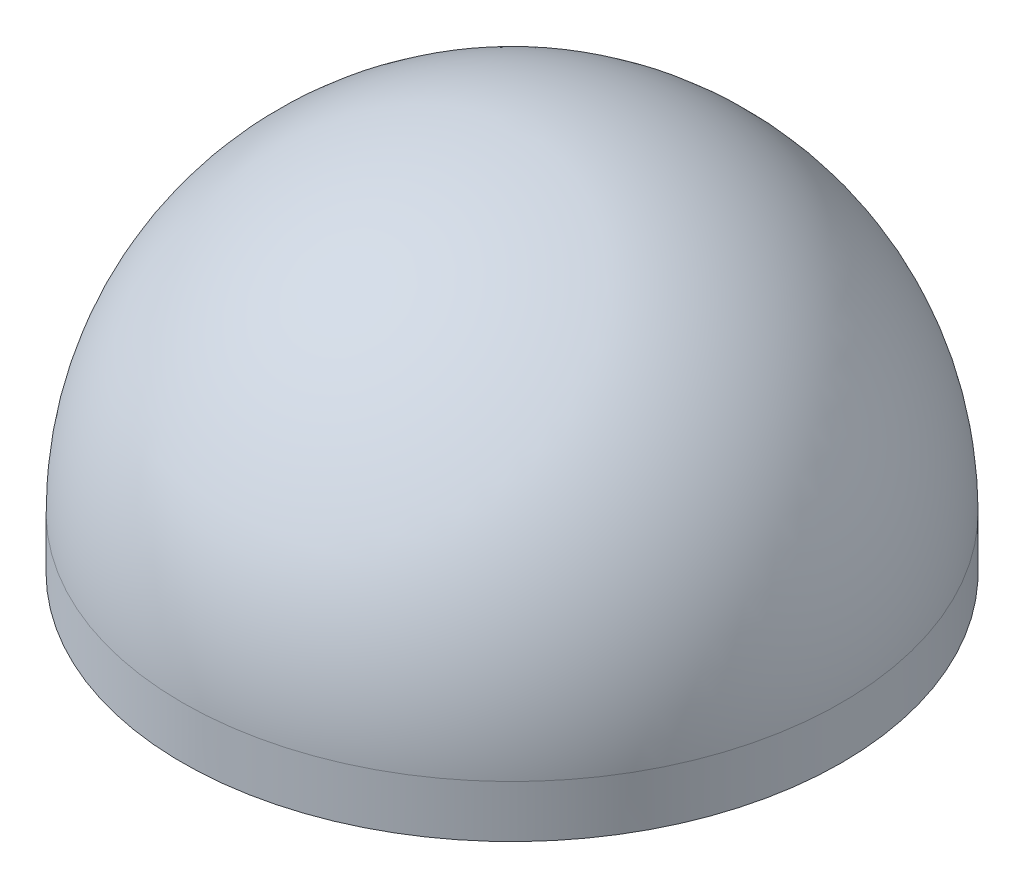
ISO-10303-21;
HEADER;
FILE_DESCRIPTION(('STEP AP214'),'2;1');
FILE_NAME('part.step','',(''),(''),'','','');
FILE_SCHEMA(('AUTOMOTIVE_DESIGN { 1 0 10303 214 1 1 1 1 }'));
ENDSEC;
DATA;
#1=APPLICATION_CONTEXT('core data for automotive mechanical design processes');
#2=APPLICATION_PROTOCOL_DEFINITION('international standard','automotive_design',2000,#1);
#3=PRODUCT_CONTEXT('',#1,'mechanical');
#4=PRODUCT('Part','Part','',(#3));
#5=PRODUCT_RELATED_PRODUCT_CATEGORY('part','',(#4));
#6=PRODUCT_DEFINITION_FORMATION('','',#4);
#7=PRODUCT_DEFINITION_CONTEXT('part definition',#1,'design');
#8=PRODUCT_DEFINITION('design','',#6,#7);
#9=PRODUCT_DEFINITION_SHAPE('','',#8);
#10=(LENGTH_UNIT() NAMED_UNIT(*) SI_UNIT(.MILLI.,.METRE.));
#11=(NAMED_UNIT(*) PLANE_ANGLE_UNIT() SI_UNIT($,.RADIAN.));
#12=(NAMED_UNIT(*) SI_UNIT($,.STERADIAN.) SOLID_ANGLE_UNIT());
#13=UNCERTAINTY_MEASURE_WITH_UNIT(LENGTH_MEASURE(1.E-05),#10,'distance_accuracy_value','');
#14=(GEOMETRIC_REPRESENTATION_CONTEXT(3) GLOBAL_UNCERTAINTY_ASSIGNED_CONTEXT((#13)) GLOBAL_UNIT_ASSIGNED_CONTEXT((#10,
#11,#12)) REPRESENTATION_CONTEXT('',''));
#15=CARTESIAN_POINT('',(0.,0.,0.));
#16=DIRECTION('',(0.,0.,1.));
#17=DIRECTION('',(1.,0.,0.));
#18=AXIS2_PLACEMENT_3D('',#15,#16,#17);
#19=CARTESIAN_POINT('',(-5.5035625372288,148.,-48.2127952499431));
#20=DIRECTION('',(0.,0.,-1.));
#21=DIRECTION('',(-1.,0.,0.));
#22=AXIS2_PLACEMENT_3D('',#19,#20,#21);
#23=SPHERICAL_SURFACE('',#22,3.8);
#24=CARTESIAN_POINT('',(-5.5035625372288,148.,-48.2127952499431));
#25=DIRECTION('',(0.,-1.,0.));
#26=DIRECTION('',(0.,0.,-1.));
#27=AXIS2_PLACEMENT_3D('',#24,#25,#26);
#28=SPHERICAL_SURFACE('',#27,3.8);
#29=CARTESIAN_POINT('',(-5.5035625372288,148.,-48.2127952499431));
#30=DIRECTION('',(0.,-1.,0.));
#31=DIRECTION('',(0.,0.,-1.));
#32=AXIS2_PLACEMENT_3D('',#29,#30,#31);
#33=CIRCLE('',#32,3.8);
#34=CARTESIAN_POINT('',(-5.5035625372288,148.,-52.0127952499431));
#35=VERTEX_POINT('',#34);
#36=EDGE_CURVE('E10',#35,#35,#33,.T.);
#37=ORIENTED_EDGE('',*,*,#36,.F.);
#38=EDGE_LOOP('',(#37));
#39=FACE_BOUND('',#38,.T.);
#40=ADVANCED_FACE('F40',(#39),#28,.T.);
#41=CARTESIAN_POINT('',(-5.5035625372288,147.4,-48.2127952499431));
#42=DIRECTION('',(0.,1.,0.));
#43=DIRECTION('',(-1.,0.,0.));
#44=AXIS2_PLACEMENT_3D('',#41,#42,#43);
#45=CYLINDRICAL_SURFACE('',#44,3.8);
#46=CARTESIAN_POINT('',(-5.5035625372288,147.4,-48.2127952499431));
#47=DIRECTION('',(0.,-1.,0.));
#48=DIRECTION('',(1.,0.,0.));
#49=AXIS2_PLACEMENT_3D('',#46,#47,#48);
#50=CIRCLE('',#49,3.8);
#51=CARTESIAN_POINT('',(-1.7035625372288,147.4,-48.2127952499431));
#52=VERTEX_POINT('',#51);
#53=EDGE_CURVE('E47',#52,#52,#50,.T.);
#54=ORIENTED_EDGE('',*,*,#53,.F.);
#55=EDGE_LOOP('',(#54));
#56=FACE_BOUND('',#55,.T.);
#57=ORIENTED_EDGE('',*,*,#36,.T.);
#58=EDGE_LOOP('',(#57));
#59=FACE_BOUND('',#58,.T.);
#60=ADVANCED_FACE('F56',(#56,#59),#45,.T.);
#61=CARTESIAN_POINT('',(-5.5035625372288,147.4,-48.2127952499431));
#62=DIRECTION('',(0.,-1.,0.));
#63=DIRECTION('',(1.,0.,0.));
#64=AXIS2_PLACEMENT_3D('',#61,#62,#63);
#65=PLANE('',#64);
#66=ORIENTED_EDGE('',*,*,#53,.T.);
#67=EDGE_LOOP('',(#66));
#68=FACE_BOUND('',#67,.T.);
#69=ADVANCED_FACE('F54',(#68),#65,.T.);
#70=CLOSED_SHELL('',(#40,#60,#69));
#71=MANIFOLD_SOLID_BREP('B2',#70);
#72=ADVANCED_BREP_SHAPE_REPRESENTATION('',(#18,#71),#14);
#73=SHAPE_DEFINITION_REPRESENTATION(#9,#72);
ENDSEC;
END-ISO-10303-21;
